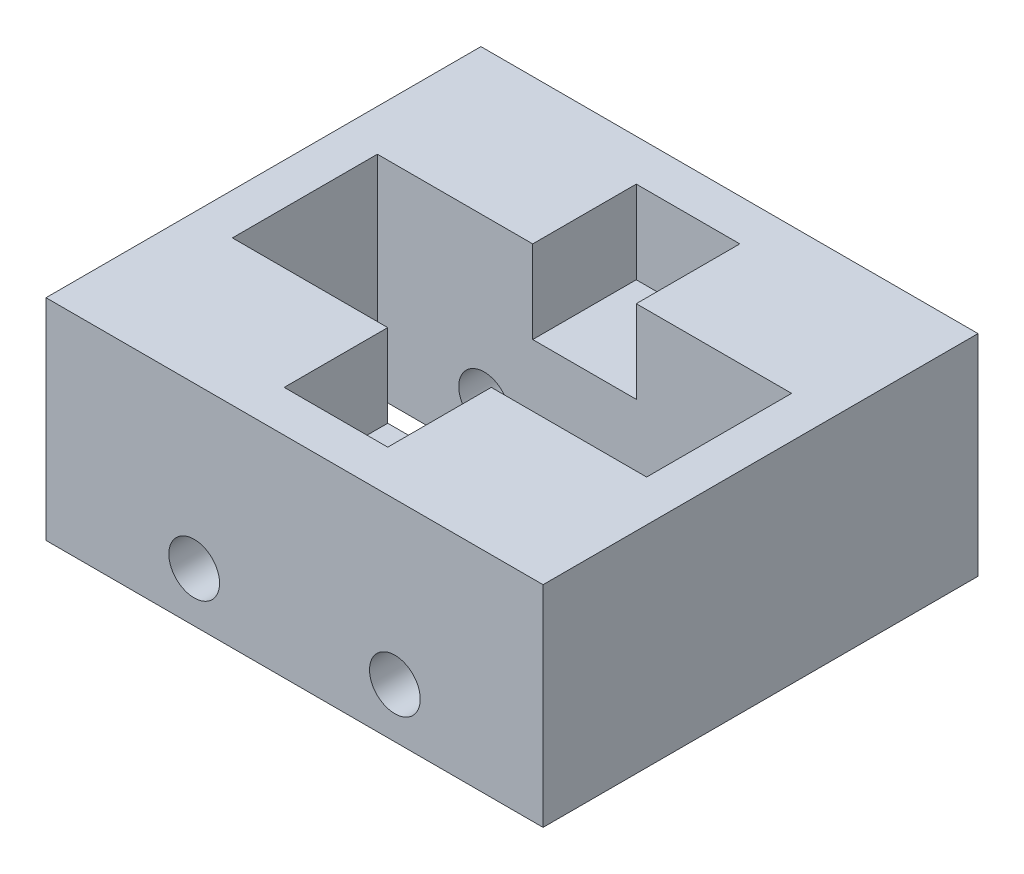
ISO-10303-21;
HEADER;
FILE_DESCRIPTION(('STEP AP214'),'2;1');
FILE_NAME('part.step','',(''),(''),'','','');
FILE_SCHEMA(('AUTOMOTIVE_DESIGN { 1 0 10303 214 1 1 1 1 }'));
ENDSEC;
DATA;
#1=APPLICATION_CONTEXT('core data for automotive mechanical design processes');
#2=APPLICATION_PROTOCOL_DEFINITION('international standard','automotive_design',2000,#1);
#3=PRODUCT_CONTEXT('',#1,'mechanical');
#4=PRODUCT('Part','Part','',(#3));
#5=PRODUCT_RELATED_PRODUCT_CATEGORY('part','',(#4));
#6=PRODUCT_DEFINITION_FORMATION('','',#4);
#7=PRODUCT_DEFINITION_CONTEXT('part definition',#1,'design');
#8=PRODUCT_DEFINITION('design','',#6,#7);
#9=PRODUCT_DEFINITION_SHAPE('','',#8);
#10=(LENGTH_UNIT() NAMED_UNIT(*) SI_UNIT(.MILLI.,.METRE.));
#11=(NAMED_UNIT(*) PLANE_ANGLE_UNIT() SI_UNIT($,.RADIAN.));
#12=(NAMED_UNIT(*) SI_UNIT($,.STERADIAN.) SOLID_ANGLE_UNIT());
#13=UNCERTAINTY_MEASURE_WITH_UNIT(LENGTH_MEASURE(1.E-05),#10,'distance_accuracy_value','');
#14=(GEOMETRIC_REPRESENTATION_CONTEXT(3) GLOBAL_UNCERTAINTY_ASSIGNED_CONTEXT((#13)) GLOBAL_UNIT_ASSIGNED_CONTEXT((#10,
#11,#12)) REPRESENTATION_CONTEXT('',''));
#15=CARTESIAN_POINT('',(0.,0.,0.));
#16=DIRECTION('',(0.,0.,1.));
#17=DIRECTION('',(1.,0.,0.));
#18=AXIS2_PLACEMENT_3D('',#15,#16,#17);
#19=CARTESIAN_POINT('',(0.,0.,0.));
#20=DIRECTION('',(0.,0.,1.));
#21=DIRECTION('',(1.,0.,0.));
#22=AXIS2_PLACEMENT_3D('',#19,#20,#21);
#23=PLANE('',#22);
#24=CARTESIAN_POINT('',(4.845,-2.67500000000001,0.));
#25=DIRECTION('',(0.,0.,1.));
#26=DIRECTION('',(1.,0.,0.));
#27=AXIS2_PLACEMENT_3D('',#24,#25,#26);
#28=CIRCLE('',#27,1.225);
#29=CARTESIAN_POINT('',(6.07,-2.67500000000001,0.));
#30=VERTEX_POINT('',#29);
#31=EDGE_CURVE('E258',#30,#30,#28,.T.);
#32=ORIENTED_EDGE('',*,*,#31,.T.);
#33=EDGE_LOOP('',(#32));
#34=FACE_BOUND('',#33,.T.);
#35=CARTESIAN_POINT('',(-4.845,-2.67500000000001,0.));
#36=DIRECTION('',(0.,0.,1.));
#37=DIRECTION('',(1.,0.,0.));
#38=AXIS2_PLACEMENT_3D('',#35,#36,#37);
#39=CIRCLE('',#38,1.225);
#40=CARTESIAN_POINT('',(-3.62,-2.67500000000001,0.));
#41=VERTEX_POINT('',#40);
#42=EDGE_CURVE('E278',#41,#41,#39,.T.);
#43=ORIENTED_EDGE('',*,*,#42,.T.);
#44=EDGE_LOOP('',(#43));
#45=FACE_BOUND('',#44,.T.);
#46=DIRECTION('',(0.,-1.,0.));
#47=VECTOR('',#46,1.);
#48=CARTESIAN_POINT('',(-10.,5.075,0.));
#49=LINE('',#48,#47);
#50=CARTESIAN_POINT('',(-10.,5.07499999999999,0.));
#51=VERTEX_POINT('',#50);
#52=CARTESIAN_POINT('',(-10.,-5.07500000000001,0.));
#53=VERTEX_POINT('',#52);
#54=EDGE_CURVE('E56',#51,#53,#49,.T.);
#55=ORIENTED_EDGE('',*,*,#54,.F.);
#56=DIRECTION('',(-1.,0.,0.));
#57=VECTOR('',#56,1.);
#58=CARTESIAN_POINT('',(0.,5.075,0.));
#59=LINE('',#58,#57);
#60=CARTESIAN_POINT('',(-2.5,5.075,0.));
#61=VERTEX_POINT('',#60);
#62=EDGE_CURVE('E292',#61,#51,#59,.T.);
#63=ORIENTED_EDGE('',*,*,#62,.F.);
#64=DIRECTION('',(0.,-1.,0.));
#65=VECTOR('',#64,1.);
#66=CARTESIAN_POINT('',(-2.5,0.,0.));
#67=LINE('',#66,#65);
#68=CARTESIAN_POINT('',(-2.5,1.07499999999999,0.));
#69=VERTEX_POINT('',#68);
#70=EDGE_CURVE('E289',#61,#69,#67,.T.);
#71=ORIENTED_EDGE('',*,*,#70,.T.);
#72=DIRECTION('',(1.,0.,0.));
#73=VECTOR('',#72,1.);
#74=CARTESIAN_POINT('',(0.,1.07499999999999,0.));
#75=LINE('',#74,#73);
#76=CARTESIAN_POINT('',(2.5,1.075,0.));
#77=VERTEX_POINT('',#76);
#78=EDGE_CURVE('E286',#69,#77,#75,.T.);
#79=ORIENTED_EDGE('',*,*,#78,.T.);
#80=DIRECTION('',(0.,-1.,0.));
#81=VECTOR('',#80,1.);
#82=CARTESIAN_POINT('',(2.5,0.,0.));
#83=LINE('',#82,#81);
#84=CARTESIAN_POINT('',(2.5,5.075,0.));
#85=VERTEX_POINT('',#84);
#86=EDGE_CURVE('E283',#85,#77,#83,.T.);
#87=ORIENTED_EDGE('',*,*,#86,.F.);
#88=DIRECTION('',(-1.,0.,0.));
#89=VECTOR('',#88,1.);
#90=CARTESIAN_POINT('',(0.,5.075,0.));
#91=LINE('',#90,#89);
#92=CARTESIAN_POINT('',(10.,5.075,0.));
#93=VERTEX_POINT('',#92);
#94=EDGE_CURVE('E281',#93,#85,#91,.T.);
#95=ORIENTED_EDGE('',*,*,#94,.F.);
#96=DIRECTION('',(0.,1.,0.));
#97=VECTOR('',#96,1.);
#98=CARTESIAN_POINT('',(10.,5.075,0.));
#99=LINE('',#98,#97);
#100=CARTESIAN_POINT('',(10.,-5.07500000000001,0.));
#101=VERTEX_POINT('',#100);
#102=EDGE_CURVE('E161',#101,#93,#99,.T.);
#103=ORIENTED_EDGE('',*,*,#102,.F.);
#104=DIRECTION('',(-1.,0.,0.));
#105=VECTOR('',#104,1.);
#106=CARTESIAN_POINT('',(0.,-5.07500000000001,0.));
#107=LINE('',#106,#105);
#108=EDGE_CURVE('E61',#101,#53,#107,.T.);
#109=ORIENTED_EDGE('',*,*,#108,.T.);
#110=EDGE_LOOP('',(#55,#63,#71,#79,#87,#95,#103,#109));
#111=FACE_BOUND('',#110,.T.);
#112=ADVANCED_FACE('F41',(#34,#45,#111),#23,.F.);
#113=CARTESIAN_POINT('',(2.5,0.,7.));
#114=DIRECTION('',(1.,0.,0.));
#115=DIRECTION('',(0.,1.,0.));
#116=AXIS2_PLACEMENT_3D('',#113,#114,#115);
#117=PLANE('',#116);
#118=DIRECTION('',(0.,0.,-1.));
#119=VECTOR('',#118,1.);
#120=CARTESIAN_POINT('',(2.5,1.075,7.));
#121=LINE('',#120,#119);
#122=CARTESIAN_POINT('',(2.5,1.075,5.));
#123=VERTEX_POINT('',#122);
#124=EDGE_CURVE('E49',#123,#77,#121,.T.);
#125=ORIENTED_EDGE('',*,*,#124,.F.);
#126=DIRECTION('',(0.,-1.,0.));
#127=VECTOR('',#126,1.);
#128=CARTESIAN_POINT('',(2.5,5.075,5.));
#129=LINE('',#128,#127);
#130=CARTESIAN_POINT('',(2.5,5.075,5.));
#131=VERTEX_POINT('',#130);
#132=EDGE_CURVE('E252',#131,#123,#129,.T.);
#133=ORIENTED_EDGE('',*,*,#132,.F.);
#134=DIRECTION('',(0.,0.,-1.));
#135=VECTOR('',#134,1.);
#136=CARTESIAN_POINT('',(2.5,5.075,7.));
#137=LINE('',#136,#135);
#138=EDGE_CURVE('E11',#131,#85,#137,.T.);
#139=ORIENTED_EDGE('',*,*,#138,.T.);
#140=ORIENTED_EDGE('',*,*,#86,.T.);
#141=EDGE_LOOP('',(#125,#133,#139,#140));
#142=FACE_BOUND('',#141,.T.);
#143=ADVANCED_FACE('F312',(#142),#117,.F.);
#144=CARTESIAN_POINT('',(0.,1.07499999999999,7.));
#145=DIRECTION('',(0.,1.,0.));
#146=DIRECTION('',(-1.,0.,0.));
#147=AXIS2_PLACEMENT_3D('',#144,#145,#146);
#148=PLANE('',#147);
#149=DIRECTION('',(-1.,0.,0.));
#150=VECTOR('',#149,1.);
#151=CARTESIAN_POINT('',(2.5,1.075,5.));
#152=LINE('',#151,#150);
#153=CARTESIAN_POINT('',(-2.5,1.07499999999999,5.));
#154=VERTEX_POINT('',#153);
#155=EDGE_CURVE('E255',#123,#154,#152,.T.);
#156=ORIENTED_EDGE('',*,*,#155,.F.);
#157=ORIENTED_EDGE('',*,*,#124,.T.);
#158=ORIENTED_EDGE('',*,*,#78,.F.);
#159=DIRECTION('',(0.,0.,-1.));
#160=VECTOR('',#159,1.);
#161=CARTESIAN_POINT('',(-2.5,1.07499999999999,7.));
#162=LINE('',#161,#160);
#163=EDGE_CURVE('E304',#154,#69,#162,.T.);
#164=ORIENTED_EDGE('',*,*,#163,.F.);
#165=EDGE_LOOP('',(#156,#157,#158,#164));
#166=FACE_BOUND('',#165,.T.);
#167=ADVANCED_FACE('F308',(#166),#148,.T.);
#168=CARTESIAN_POINT('',(-2.5,0.,7.));
#169=DIRECTION('',(1.,0.,0.));
#170=DIRECTION('',(0.,1.,0.));
#171=AXIS2_PLACEMENT_3D('',#168,#169,#170);
#172=PLANE('',#171);
#173=DIRECTION('',(0.,1.,0.));
#174=VECTOR('',#173,1.);
#175=CARTESIAN_POINT('',(-2.5,1.07499999999999,5.));
#176=LINE('',#175,#174);
#177=CARTESIAN_POINT('',(-2.5,5.075,5.));
#178=VERTEX_POINT('',#177);
#179=EDGE_CURVE('E246',#154,#178,#176,.T.);
#180=ORIENTED_EDGE('',*,*,#179,.F.);
#181=ORIENTED_EDGE('',*,*,#163,.T.);
#182=ORIENTED_EDGE('',*,*,#70,.F.);
#183=DIRECTION('',(0.,0.,-1.));
#184=VECTOR('',#183,1.);
#185=CARTESIAN_POINT('',(-2.5,5.075,7.));
#186=LINE('',#185,#184);
#187=EDGE_CURVE('E302',#178,#61,#186,.T.);
#188=ORIENTED_EDGE('',*,*,#187,.F.);
#189=EDGE_LOOP('',(#180,#181,#182,#188));
#190=FACE_BOUND('',#189,.T.);
#191=ADVANCED_FACE('F316',(#190),#172,.T.);
#192=CARTESIAN_POINT('',(0.,5.075,7.));
#193=DIRECTION('',(0.,-1.,0.));
#194=DIRECTION('',(1.,0.,0.));
#195=AXIS2_PLACEMENT_3D('',#192,#193,#194);
#196=PLANE('',#195);
#197=DIRECTION('',(0.,0.,1.));
#198=VECTOR('',#197,1.);
#199=CARTESIAN_POINT('',(10.,5.075,-7.));
#200=LINE('',#199,#198);
#201=CARTESIAN_POINT('',(10.,5.075,-7.));
#202=VERTEX_POINT('',#201);
#203=EDGE_CURVE('E154',#202,#93,#200,.T.);
#204=ORIENTED_EDGE('',*,*,#203,.T.);
#205=ORIENTED_EDGE('',*,*,#94,.T.);
#206=ORIENTED_EDGE('',*,*,#138,.F.);
#207=DIRECTION('',(1.,0.,0.));
#208=VECTOR('',#207,1.);
#209=CARTESIAN_POINT('',(-2.5,5.075,5.));
#210=LINE('',#209,#208);
#211=EDGE_CURVE('E249',#178,#131,#210,.T.);
#212=ORIENTED_EDGE('',*,*,#211,.F.);
#213=ORIENTED_EDGE('',*,*,#187,.T.);
#214=ORIENTED_EDGE('',*,*,#62,.T.);
#215=DIRECTION('',(0.,0.,1.));
#216=VECTOR('',#215,1.);
#217=CARTESIAN_POINT('',(-10.,5.075,-7.));
#218=LINE('',#217,#216);
#219=CARTESIAN_POINT('',(-10.,5.075,-7.));
#220=VERTEX_POINT('',#219);
#221=EDGE_CURVE('E237',#220,#51,#218,.T.);
#222=ORIENTED_EDGE('',*,*,#221,.F.);
#223=DIRECTION('',(-1.,0.,0.));
#224=VECTOR('',#223,1.);
#225=CARTESIAN_POINT('',(0.,5.075,-7.));
#226=LINE('',#225,#224);
#227=CARTESIAN_POINT('',(-2.5,5.075,-7.));
#228=VERTEX_POINT('',#227);
#229=EDGE_CURVE('E227',#228,#220,#226,.T.);
#230=ORIENTED_EDGE('',*,*,#229,.F.);
#231=DIRECTION('',(0.,0.,1.));
#232=VECTOR('',#231,1.);
#233=CARTESIAN_POINT('',(-2.5,5.075,-14.));
#234=LINE('',#233,#232);
#235=CARTESIAN_POINT('',(-2.5,5.075,-12.));
#236=VERTEX_POINT('',#235);
#237=EDGE_CURVE('E215',#236,#228,#234,.T.);
#238=ORIENTED_EDGE('',*,*,#237,.F.);
#239=DIRECTION('',(1.,0.,0.));
#240=VECTOR('',#239,1.);
#241=CARTESIAN_POINT('',(-2.5,5.075,-12.));
#242=LINE('',#241,#240);
#243=CARTESIAN_POINT('',(2.5,5.075,-12.));
#244=VERTEX_POINT('',#243);
#245=EDGE_CURVE('E185',#236,#244,#242,.T.);
#246=ORIENTED_EDGE('',*,*,#245,.T.);
#247=DIRECTION('',(0.,0.,1.));
#248=VECTOR('',#247,1.);
#249=CARTESIAN_POINT('',(2.5,5.075,-14.));
#250=LINE('',#249,#248);
#251=CARTESIAN_POINT('',(2.5,5.075,-7.));
#252=VERTEX_POINT('',#251);
#253=EDGE_CURVE('E170',#244,#252,#250,.T.);
#254=ORIENTED_EDGE('',*,*,#253,.T.);
#255=DIRECTION('',(-1.,0.,0.));
#256=VECTOR('',#255,1.);
#257=CARTESIAN_POINT('',(0.,5.075,-7.));
#258=LINE('',#257,#256);
#259=EDGE_CURVE('E166',#202,#252,#258,.T.);
#260=ORIENTED_EDGE('',*,*,#259,.F.);
#261=EDGE_LOOP('',(#204,#205,#206,#212,#213,#214,#222,#230,#238,#246,#254,#260));
#262=FACE_BOUND('',#261,.T.);
#263=DIRECTION('',(-1.,0.,0.));
#264=VECTOR('',#263,1.);
#265=CARTESIAN_POINT('',(0.,5.075,-14.));
#266=LINE('',#265,#264);
#267=CARTESIAN_POINT('',(12.,5.075,-14.));
#268=VERTEX_POINT('',#267);
#269=CARTESIAN_POINT('',(-12.,5.07499999999999,-14.));
#270=VERTEX_POINT('',#269);
#271=EDGE_CURVE('E203',#268,#270,#266,.T.);
#272=ORIENTED_EDGE('',*,*,#271,.T.);
#273=DIRECTION('',(0.,0.,-1.));
#274=VECTOR('',#273,1.);
#275=CARTESIAN_POINT('',(-12.,5.07499999999999,7.));
#276=LINE('',#275,#274);
#277=CARTESIAN_POINT('',(-12.,5.07499999999999,7.));
#278=VERTEX_POINT('',#277);
#279=EDGE_CURVE('E300',#278,#270,#276,.T.);
#280=ORIENTED_EDGE('',*,*,#279,.F.);
#281=DIRECTION('',(-1.,0.,0.));
#282=VECTOR('',#281,1.);
#283=CARTESIAN_POINT('',(0.,5.075,7.));
#284=LINE('',#283,#282);
#285=CARTESIAN_POINT('',(12.,5.075,7.));
#286=VERTEX_POINT('',#285);
#287=EDGE_CURVE('E265',#286,#278,#284,.T.);
#288=ORIENTED_EDGE('',*,*,#287,.F.);
#289=DIRECTION('',(0.,0.,-1.));
#290=VECTOR('',#289,1.);
#291=CARTESIAN_POINT('',(12.,5.075,7.));
#292=LINE('',#291,#290);
#293=EDGE_CURVE('E275',#286,#268,#292,.T.);
#294=ORIENTED_EDGE('',*,*,#293,.T.);
#295=EDGE_LOOP('',(#272,#280,#288,#294));
#296=FACE_BOUND('',#295,.T.);
#297=ADVANCED_FACE('F167',(#262,#296),#196,.F.);
#298=CARTESIAN_POINT('',(-12.,0.,7.));
#299=DIRECTION('',(-1.,0.,0.));
#300=DIRECTION('',(0.,-1.,0.));
#301=AXIS2_PLACEMENT_3D('',#298,#299,#300);
#302=PLANE('',#301);
#303=DIRECTION('',(0.,1.,0.));
#304=VECTOR('',#303,1.);
#305=CARTESIAN_POINT('',(-12.,0.,-14.));
#306=LINE('',#305,#304);
#307=CARTESIAN_POINT('',(-12.,-5.07500000000001,-14.));
#308=VERTEX_POINT('',#307);
#309=EDGE_CURVE('E206',#308,#270,#306,.T.);
#310=ORIENTED_EDGE('',*,*,#309,.F.);
#311=DIRECTION('',(0.,0.,-1.));
#312=VECTOR('',#311,1.);
#313=CARTESIAN_POINT('',(-12.,-5.07500000000001,7.));
#314=LINE('',#313,#312);
#315=CARTESIAN_POINT('',(-12.,-5.07500000000001,7.));
#316=VERTEX_POINT('',#315);
#317=EDGE_CURVE('E298',#316,#308,#314,.T.);
#318=ORIENTED_EDGE('',*,*,#317,.F.);
#319=DIRECTION('',(0.,1.,0.));
#320=VECTOR('',#319,1.);
#321=CARTESIAN_POINT('',(-12.,0.,7.));
#322=LINE('',#321,#320);
#323=EDGE_CURVE('E267',#316,#278,#322,.T.);
#324=ORIENTED_EDGE('',*,*,#323,.T.);
#325=ORIENTED_EDGE('',*,*,#279,.T.);
#326=EDGE_LOOP('',(#310,#318,#324,#325));
#327=FACE_BOUND('',#326,.T.);
#328=ADVANCED_FACE('F369',(#327),#302,.T.);
#329=CARTESIAN_POINT('',(0.,-5.07500000000001,7.));
#330=DIRECTION('',(0.,-1.,0.));
#331=DIRECTION('',(1.,0.,0.));
#332=AXIS2_PLACEMENT_3D('',#329,#330,#331);
#333=PLANE('',#332);
#334=ORIENTED_EDGE('',*,*,#108,.F.);
#335=DIRECTION('',(0.,0.,1.));
#336=VECTOR('',#335,1.);
#337=CARTESIAN_POINT('',(10.,-5.07500000000001,-7.));
#338=LINE('',#337,#336);
#339=CARTESIAN_POINT('',(10.,-5.07500000000001,-7.));
#340=VERTEX_POINT('',#339);
#341=EDGE_CURVE('E163',#340,#101,#338,.T.);
#342=ORIENTED_EDGE('',*,*,#341,.F.);
#343=DIRECTION('',(-1.,0.,0.));
#344=VECTOR('',#343,1.);
#345=CARTESIAN_POINT('',(0.,-5.07500000000001,-7.));
#346=LINE('',#345,#344);
#347=CARTESIAN_POINT('',(-10.,-5.07500000000001,-7.));
#348=VERTEX_POINT('',#347);
#349=EDGE_CURVE('E180',#340,#348,#346,.T.);
#350=ORIENTED_EDGE('',*,*,#349,.T.);
#351=DIRECTION('',(0.,0.,1.));
#352=VECTOR('',#351,1.);
#353=CARTESIAN_POINT('',(-10.,-5.075,-7.));
#354=LINE('',#353,#352);
#355=EDGE_CURVE('E240',#348,#53,#354,.T.);
#356=ORIENTED_EDGE('',*,*,#355,.T.);
#357=EDGE_LOOP('',(#334,#342,#350,#356));
#358=FACE_BOUND('',#357,.T.);
#359=DIRECTION('',(-1.,0.,0.));
#360=VECTOR('',#359,1.);
#361=CARTESIAN_POINT('',(0.,-5.07500000000001,-14.));
#362=LINE('',#361,#360);
#363=CARTESIAN_POINT('',(12.,-5.07500000000001,-14.));
#364=VERTEX_POINT('',#363);
#365=EDGE_CURVE('E209',#364,#308,#362,.T.);
#366=ORIENTED_EDGE('',*,*,#365,.F.);
#367=DIRECTION('',(0.,0.,-1.));
#368=VECTOR('',#367,1.);
#369=CARTESIAN_POINT('',(12.,-5.07500000000001,7.));
#370=LINE('',#369,#368);
#371=CARTESIAN_POINT('',(12.,-5.07500000000001,7.));
#372=VERTEX_POINT('',#371);
#373=EDGE_CURVE('E296',#372,#364,#370,.T.);
#374=ORIENTED_EDGE('',*,*,#373,.F.);
#375=DIRECTION('',(-1.,0.,0.));
#376=VECTOR('',#375,1.);
#377=CARTESIAN_POINT('',(0.,-5.07500000000001,7.));
#378=LINE('',#377,#376);
#379=EDGE_CURVE('E270',#372,#316,#378,.T.);
#380=ORIENTED_EDGE('',*,*,#379,.T.);
#381=ORIENTED_EDGE('',*,*,#317,.T.);
#382=EDGE_LOOP('',(#366,#374,#380,#381));
#383=FACE_BOUND('',#382,.T.);
#384=ADVANCED_FACE('F321',(#358,#383),#333,.T.);
#385=CARTESIAN_POINT('',(-4.845,-2.67500000000001,7.));
#386=DIRECTION('',(0.,0.,-1.));
#387=DIRECTION('',(-1.,0.,0.));
#388=AXIS2_PLACEMENT_3D('',#385,#386,#387);
#389=CYLINDRICAL_SURFACE('',#388,1.225);
#390=CARTESIAN_POINT('',(-4.845,-2.67500000000001,7.));
#391=DIRECTION('',(0.,0.,1.));
#392=DIRECTION('',(1.,0.,0.));
#393=AXIS2_PLACEMENT_3D('',#390,#391,#392);
#394=CIRCLE('',#393,1.225);
#395=CARTESIAN_POINT('',(-3.62,-2.67500000000001,7.));
#396=VERTEX_POINT('',#395);
#397=EDGE_CURVE('E262',#396,#396,#394,.T.);
#398=ORIENTED_EDGE('',*,*,#397,.T.);
#399=EDGE_LOOP('',(#398));
#400=FACE_BOUND('',#399,.T.);
#401=ORIENTED_EDGE('',*,*,#42,.F.);
#402=EDGE_LOOP('',(#401));
#403=FACE_BOUND('',#402,.T.);
#404=ADVANCED_FACE('F368',(#400,#403),#389,.F.);
#405=CARTESIAN_POINT('',(4.845,-2.67500000000001,7.));
#406=DIRECTION('',(0.,0.,-1.));
#407=DIRECTION('',(-1.,0.,0.));
#408=AXIS2_PLACEMENT_3D('',#405,#406,#407);
#409=CYLINDRICAL_SURFACE('',#408,1.225);
#410=CARTESIAN_POINT('',(4.845,-2.67500000000001,7.));
#411=DIRECTION('',(0.,0.,1.));
#412=DIRECTION('',(1.,0.,0.));
#413=AXIS2_PLACEMENT_3D('',#410,#411,#412);
#414=CIRCLE('',#413,1.225);
#415=CARTESIAN_POINT('',(6.07,-2.67500000000001,7.));
#416=VERTEX_POINT('',#415);
#417=EDGE_CURVE('E259',#416,#416,#414,.T.);
#418=ORIENTED_EDGE('',*,*,#417,.T.);
#419=EDGE_LOOP('',(#418));
#420=FACE_BOUND('',#419,.T.);
#421=ORIENTED_EDGE('',*,*,#31,.F.);
#422=EDGE_LOOP('',(#421));
#423=FACE_BOUND('',#422,.T.);
#424=ADVANCED_FACE('F43',(#420,#423),#409,.F.);
#425=CARTESIAN_POINT('',(12.,0.,7.));
#426=DIRECTION('',(-1.,0.,0.));
#427=DIRECTION('',(0.,-1.,0.));
#428=AXIS2_PLACEMENT_3D('',#425,#426,#427);
#429=PLANE('',#428);
#430=ORIENTED_EDGE('',*,*,#373,.T.);
#431=DIRECTION('',(0.,1.,0.));
#432=VECTOR('',#431,1.);
#433=CARTESIAN_POINT('',(12.,0.,-14.));
#434=LINE('',#433,#432);
#435=EDGE_CURVE('E212',#364,#268,#434,.T.);
#436=ORIENTED_EDGE('',*,*,#435,.T.);
#437=ORIENTED_EDGE('',*,*,#293,.F.);
#438=DIRECTION('',(0.,1.,0.));
#439=VECTOR('',#438,1.);
#440=CARTESIAN_POINT('',(12.,0.,7.));
#441=LINE('',#440,#439);
#442=EDGE_CURVE('E273',#372,#286,#441,.T.);
#443=ORIENTED_EDGE('',*,*,#442,.F.);
#444=EDGE_LOOP('',(#430,#436,#437,#443));
#445=FACE_BOUND('',#444,.T.);
#446=ADVANCED_FACE('F362',(#445),#429,.F.);
#447=CARTESIAN_POINT('',(0.,0.,7.));
#448=DIRECTION('',(0.,0.,1.));
#449=DIRECTION('',(1.,0.,0.));
#450=AXIS2_PLACEMENT_3D('',#447,#448,#449);
#451=PLANE('',#450);
#452=ORIENTED_EDGE('',*,*,#417,.F.);
#453=EDGE_LOOP('',(#452));
#454=FACE_BOUND('',#453,.T.);
#455=ORIENTED_EDGE('',*,*,#397,.F.);
#456=EDGE_LOOP('',(#455));
#457=FACE_BOUND('',#456,.T.);
#458=ORIENTED_EDGE('',*,*,#287,.T.);
#459=ORIENTED_EDGE('',*,*,#323,.F.);
#460=ORIENTED_EDGE('',*,*,#379,.F.);
#461=ORIENTED_EDGE('',*,*,#442,.T.);
#462=EDGE_LOOP('',(#458,#459,#460,#461));
#463=FACE_BOUND('',#462,.T.);
#464=ADVANCED_FACE('F360',(#454,#457,#463),#451,.T.);
#465=CARTESIAN_POINT('',(0.,0.,5.));
#466=DIRECTION('',(0.,0.,-1.));
#467=DIRECTION('',(-1.,0.,0.));
#468=AXIS2_PLACEMENT_3D('',#465,#466,#467);
#469=PLANE('',#468);
#470=ORIENTED_EDGE('',*,*,#179,.T.);
#471=ORIENTED_EDGE('',*,*,#211,.T.);
#472=ORIENTED_EDGE('',*,*,#132,.T.);
#473=ORIENTED_EDGE('',*,*,#155,.T.);
#474=EDGE_LOOP('',(#470,#471,#472,#473));
#475=FACE_BOUND('',#474,.T.);
#476=ADVANCED_FACE('F319',(#475),#469,.T.);
#477=CARTESIAN_POINT('',(10.,5.075,-7.));
#478=DIRECTION('',(1.,0.,0.));
#479=DIRECTION('',(0.,1.,0.));
#480=AXIS2_PLACEMENT_3D('',#477,#478,#479);
#481=PLANE('',#480);
#482=ORIENTED_EDGE('',*,*,#102,.T.);
#483=ORIENTED_EDGE('',*,*,#203,.F.);
#484=DIRECTION('',(0.,1.,0.));
#485=VECTOR('',#484,1.);
#486=CARTESIAN_POINT('',(10.,5.075,-7.));
#487=LINE('',#486,#485);
#488=EDGE_CURVE('E159',#340,#202,#487,.T.);
#489=ORIENTED_EDGE('',*,*,#488,.F.);
#490=ORIENTED_EDGE('',*,*,#341,.T.);
#491=EDGE_LOOP('',(#482,#483,#489,#490));
#492=FACE_BOUND('',#491,.T.);
#493=ADVANCED_FACE('F156',(#492),#481,.F.);
#494=CARTESIAN_POINT('',(-10.,5.075,-7.));
#495=DIRECTION('',(-1.,0.,0.));
#496=DIRECTION('',(0.,-1.,0.));
#497=AXIS2_PLACEMENT_3D('',#494,#495,#496);
#498=PLANE('',#497);
#499=ORIENTED_EDGE('',*,*,#54,.T.);
#500=ORIENTED_EDGE('',*,*,#355,.F.);
#501=DIRECTION('',(0.,-1.,0.));
#502=VECTOR('',#501,1.);
#503=CARTESIAN_POINT('',(-10.,5.075,-7.));
#504=LINE('',#503,#502);
#505=EDGE_CURVE('E182',#220,#348,#504,.T.);
#506=ORIENTED_EDGE('',*,*,#505,.F.);
#507=ORIENTED_EDGE('',*,*,#221,.T.);
#508=EDGE_LOOP('',(#499,#500,#506,#507));
#509=FACE_BOUND('',#508,.T.);
#510=ADVANCED_FACE('F325',(#509),#498,.F.);
#511=CARTESIAN_POINT('',(0.,0.,-7.));
#512=DIRECTION('',(0.,0.,-1.));
#513=DIRECTION('',(1.,0.,0.));
#514=AXIS2_PLACEMENT_3D('',#511,#512,#513);
#515=PLANE('',#514);
#516=CARTESIAN_POINT('',(4.845,-2.67500000000001,-7.));
#517=DIRECTION('',(0.,0.,1.));
#518=DIRECTION('',(1.,0.,0.));
#519=AXIS2_PLACEMENT_3D('',#516,#517,#518);
#520=CIRCLE('',#519,1.225);
#521=CARTESIAN_POINT('',(6.07,-2.67500000000001,-7.));
#522=VERTEX_POINT('',#521);
#523=EDGE_CURVE('E196',#522,#522,#520,.T.);
#524=ORIENTED_EDGE('',*,*,#523,.F.);
#525=EDGE_LOOP('',(#524));
#526=FACE_BOUND('',#525,.T.);
#527=CARTESIAN_POINT('',(-4.845,-2.67500000000001,-7.));
#528=DIRECTION('',(0.,0.,1.));
#529=DIRECTION('',(1.,0.,0.));
#530=AXIS2_PLACEMENT_3D('',#527,#528,#529);
#531=CIRCLE('',#530,1.225);
#532=CARTESIAN_POINT('',(-3.62,-2.67500000000001,-7.));
#533=VERTEX_POINT('',#532);
#534=EDGE_CURVE('E175',#533,#533,#531,.T.);
#535=ORIENTED_EDGE('',*,*,#534,.F.);
#536=EDGE_LOOP('',(#535));
#537=FACE_BOUND('',#536,.T.);
#538=ORIENTED_EDGE('',*,*,#505,.T.);
#539=ORIENTED_EDGE('',*,*,#349,.F.);
#540=ORIENTED_EDGE('',*,*,#488,.T.);
#541=ORIENTED_EDGE('',*,*,#259,.T.);
#542=DIRECTION('',(0.,-1.,0.));
#543=VECTOR('',#542,1.);
#544=CARTESIAN_POINT('',(2.5,0.,-7.));
#545=LINE('',#544,#543);
#546=CARTESIAN_POINT('',(2.5,1.075,-7.));
#547=VERTEX_POINT('',#546);
#548=EDGE_CURVE('E174',#252,#547,#545,.T.);
#549=ORIENTED_EDGE('',*,*,#548,.T.);
#550=DIRECTION('',(1.,0.,0.));
#551=VECTOR('',#550,1.);
#552=CARTESIAN_POINT('',(0.,1.07499999999999,-7.));
#553=LINE('',#552,#551);
#554=CARTESIAN_POINT('',(-2.5,1.07499999999999,-7.));
#555=VERTEX_POINT('',#554);
#556=EDGE_CURVE('E221',#555,#547,#553,.T.);
#557=ORIENTED_EDGE('',*,*,#556,.F.);
#558=DIRECTION('',(0.,-1.,0.));
#559=VECTOR('',#558,1.);
#560=CARTESIAN_POINT('',(-2.5,0.,-7.));
#561=LINE('',#560,#559);
#562=EDGE_CURVE('E224',#228,#555,#561,.T.);
#563=ORIENTED_EDGE('',*,*,#562,.F.);
#564=ORIENTED_EDGE('',*,*,#229,.T.);
#565=EDGE_LOOP('',(#538,#539,#540,#541,#549,#557,#563,#564));
#566=FACE_BOUND('',#565,.T.);
#567=ADVANCED_FACE('F178',(#526,#537,#566),#515,.F.);
#568=CARTESIAN_POINT('',(2.5,0.,-14.));
#569=DIRECTION('',(1.,0.,0.));
#570=DIRECTION('',(0.,1.,0.));
#571=AXIS2_PLACEMENT_3D('',#568,#569,#570);
#572=PLANE('',#571);
#573=DIRECTION('',(0.,0.,1.));
#574=VECTOR('',#573,1.);
#575=CARTESIAN_POINT('',(2.5,1.075,-14.));
#576=LINE('',#575,#574);
#577=CARTESIAN_POINT('',(2.5,1.075,-12.));
#578=VERTEX_POINT('',#577);
#579=EDGE_CURVE('E234',#578,#547,#576,.T.);
#580=ORIENTED_EDGE('',*,*,#579,.T.);
#581=ORIENTED_EDGE('',*,*,#548,.F.);
#582=ORIENTED_EDGE('',*,*,#253,.F.);
#583=DIRECTION('',(0.,-1.,0.));
#584=VECTOR('',#583,1.);
#585=CARTESIAN_POINT('',(2.5,5.075,-12.));
#586=LINE('',#585,#584);
#587=EDGE_CURVE('E190',#244,#578,#586,.T.);
#588=ORIENTED_EDGE('',*,*,#587,.T.);
#589=EDGE_LOOP('',(#580,#581,#582,#588));
#590=FACE_BOUND('',#589,.T.);
#591=ADVANCED_FACE('F338',(#590),#572,.F.);
#592=CARTESIAN_POINT('',(0.,1.07499999999999,-14.));
#593=DIRECTION('',(0.,1.,0.));
#594=DIRECTION('',(-1.,0.,0.));
#595=AXIS2_PLACEMENT_3D('',#592,#593,#594);
#596=PLANE('',#595);
#597=DIRECTION('',(-1.,0.,0.));
#598=VECTOR('',#597,1.);
#599=CARTESIAN_POINT('',(2.5,1.075,-12.));
#600=LINE('',#599,#598);
#601=CARTESIAN_POINT('',(-2.5,1.07499999999999,-12.));
#602=VERTEX_POINT('',#601);
#603=EDGE_CURVE('E193',#578,#602,#600,.T.);
#604=ORIENTED_EDGE('',*,*,#603,.T.);
#605=DIRECTION('',(0.,0.,1.));
#606=VECTOR('',#605,1.);
#607=CARTESIAN_POINT('',(-2.5,1.07499999999999,-14.));
#608=LINE('',#607,#606);
#609=EDGE_CURVE('E232',#602,#555,#608,.T.);
#610=ORIENTED_EDGE('',*,*,#609,.T.);
#611=ORIENTED_EDGE('',*,*,#556,.T.);
#612=ORIENTED_EDGE('',*,*,#579,.F.);
#613=EDGE_LOOP('',(#604,#610,#611,#612));
#614=FACE_BOUND('',#613,.T.);
#615=ADVANCED_FACE('F340',(#614),#596,.T.);
#616=CARTESIAN_POINT('',(-2.5,0.,-14.));
#617=DIRECTION('',(1.,0.,0.));
#618=DIRECTION('',(0.,1.,0.));
#619=AXIS2_PLACEMENT_3D('',#616,#617,#618);
#620=PLANE('',#619);
#621=DIRECTION('',(0.,1.,0.));
#622=VECTOR('',#621,1.);
#623=CARTESIAN_POINT('',(-2.5,1.07499999999999,-12.));
#624=LINE('',#623,#622);
#625=EDGE_CURVE('E181',#602,#236,#624,.T.);
#626=ORIENTED_EDGE('',*,*,#625,.T.);
#627=ORIENTED_EDGE('',*,*,#237,.T.);
#628=ORIENTED_EDGE('',*,*,#562,.T.);
#629=ORIENTED_EDGE('',*,*,#609,.F.);
#630=EDGE_LOOP('',(#626,#627,#628,#629));
#631=FACE_BOUND('',#630,.T.);
#632=ADVANCED_FACE('F332',(#631),#620,.T.);
#633=CARTESIAN_POINT('',(-4.845,-2.67500000000001,-14.));
#634=DIRECTION('',(0.,0.,1.));
#635=DIRECTION('',(-1.,0.,0.));
#636=AXIS2_PLACEMENT_3D('',#633,#634,#635);
#637=CYLINDRICAL_SURFACE('',#636,1.225);
#638=CARTESIAN_POINT('',(-4.845,-2.67500000000001,-14.));
#639=DIRECTION('',(0.,0.,1.));
#640=DIRECTION('',(1.,0.,0.));
#641=AXIS2_PLACEMENT_3D('',#638,#639,#640);
#642=CIRCLE('',#641,1.225);
#643=CARTESIAN_POINT('',(-3.62,-2.67500000000001,-14.));
#644=VERTEX_POINT('',#643);
#645=EDGE_CURVE('E200',#644,#644,#642,.T.);
#646=ORIENTED_EDGE('',*,*,#645,.F.);
#647=EDGE_LOOP('',(#646));
#648=FACE_BOUND('',#647,.T.);
#649=ORIENTED_EDGE('',*,*,#534,.T.);
#650=EDGE_LOOP('',(#649));
#651=FACE_BOUND('',#650,.T.);
#652=ADVANCED_FACE('F347',(#648,#651),#637,.F.);
#653=CARTESIAN_POINT('',(4.845,-2.67500000000001,-14.));
#654=DIRECTION('',(0.,0.,1.));
#655=DIRECTION('',(-1.,0.,0.));
#656=AXIS2_PLACEMENT_3D('',#653,#654,#655);
#657=CYLINDRICAL_SURFACE('',#656,1.225);
#658=CARTESIAN_POINT('',(4.845,-2.67500000000001,-14.));
#659=DIRECTION('',(0.,0.,1.));
#660=DIRECTION('',(1.,0.,0.));
#661=AXIS2_PLACEMENT_3D('',#658,#659,#660);
#662=CIRCLE('',#661,1.225);
#663=CARTESIAN_POINT('',(6.07,-2.67500000000001,-14.));
#664=VERTEX_POINT('',#663);
#665=EDGE_CURVE('E197',#664,#664,#662,.T.);
#666=ORIENTED_EDGE('',*,*,#665,.F.);
#667=EDGE_LOOP('',(#666));
#668=FACE_BOUND('',#667,.T.);
#669=ORIENTED_EDGE('',*,*,#523,.T.);
#670=EDGE_LOOP('',(#669));
#671=FACE_BOUND('',#670,.T.);
#672=ADVANCED_FACE('F404',(#668,#671),#657,.F.);
#673=CARTESIAN_POINT('',(0.,0.,-14.));
#674=DIRECTION('',(0.,0.,-1.));
#675=DIRECTION('',(1.,0.,0.));
#676=AXIS2_PLACEMENT_3D('',#673,#674,#675);
#677=PLANE('',#676);
#678=ORIENTED_EDGE('',*,*,#665,.T.);
#679=EDGE_LOOP('',(#678));
#680=FACE_BOUND('',#679,.T.);
#681=ORIENTED_EDGE('',*,*,#645,.T.);
#682=EDGE_LOOP('',(#681));
#683=FACE_BOUND('',#682,.T.);
#684=ORIENTED_EDGE('',*,*,#271,.F.);
#685=ORIENTED_EDGE('',*,*,#435,.F.);
#686=ORIENTED_EDGE('',*,*,#365,.T.);
#687=ORIENTED_EDGE('',*,*,#309,.T.);
#688=EDGE_LOOP('',(#684,#685,#686,#687));
#689=FACE_BOUND('',#688,.T.);
#690=ADVANCED_FACE('F402',(#680,#683,#689),#677,.T.);
#691=CARTESIAN_POINT('',(0.,0.,-12.));
#692=DIRECTION('',(0.,0.,1.));
#693=DIRECTION('',(-1.,0.,0.));
#694=AXIS2_PLACEMENT_3D('',#691,#692,#693);
#695=PLANE('',#694);
#696=ORIENTED_EDGE('',*,*,#625,.F.);
#697=ORIENTED_EDGE('',*,*,#603,.F.);
#698=ORIENTED_EDGE('',*,*,#587,.F.);
#699=ORIENTED_EDGE('',*,*,#245,.F.);
#700=EDGE_LOOP('',(#696,#697,#698,#699));
#701=FACE_BOUND('',#700,.T.);
#702=ADVANCED_FACE('F334',(#701),#695,.T.);
#703=CLOSED_SHELL('',(#112,#143,#167,#191,#297,#328,#384,#404,#424,#446,#464,#476,#493,#510,
#567,#591,#615,#632,#652,#672,#690,#702));
#704=MANIFOLD_SOLID_BREP('B2',#703);
#705=ADVANCED_BREP_SHAPE_REPRESENTATION('',(#18,#704),#14);
#706=SHAPE_DEFINITION_REPRESENTATION(#9,#705);
ENDSEC;
END-ISO-10303-21;
